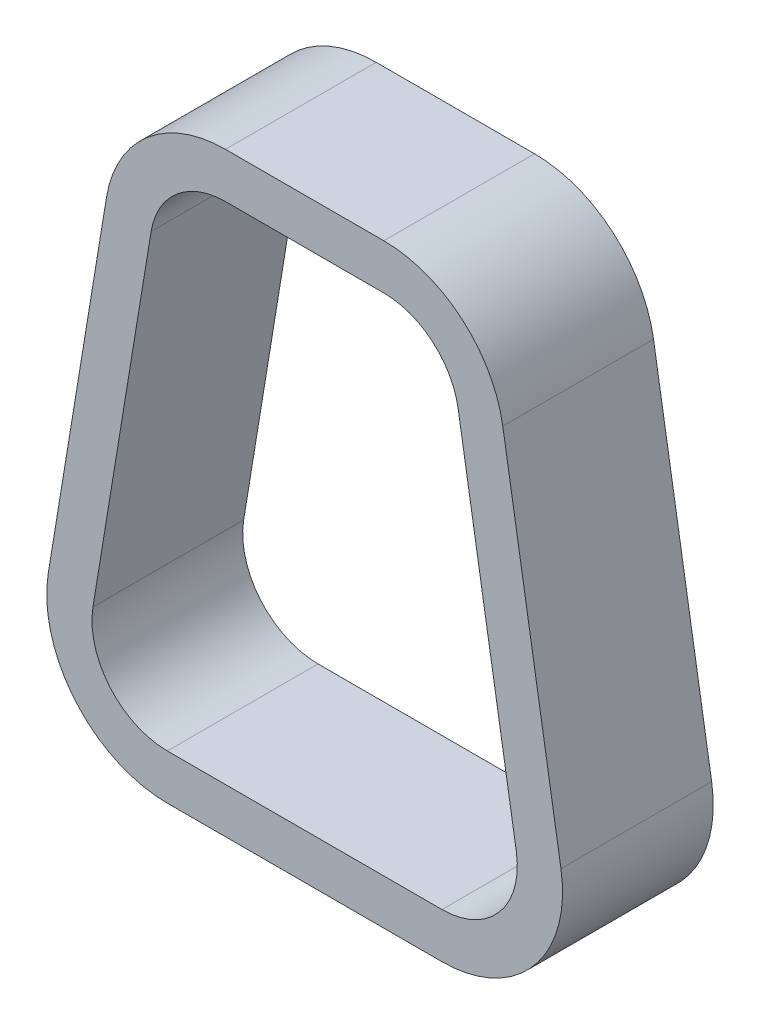
ISO-10303-21;
HEADER;
FILE_DESCRIPTION(('STEP AP214'),'2;1');
FILE_NAME('part.step','',(''),(''),'','','');
FILE_SCHEMA(('AUTOMOTIVE_DESIGN { 1 0 10303 214 1 1 1 1 }'));
ENDSEC;
DATA;
#1=APPLICATION_CONTEXT('core data for automotive mechanical design processes');
#2=APPLICATION_PROTOCOL_DEFINITION('international standard','automotive_design',2000,#1);
#3=PRODUCT_CONTEXT('',#1,'mechanical');
#4=PRODUCT('Part','Part','',(#3));
#5=PRODUCT_RELATED_PRODUCT_CATEGORY('part','',(#4));
#6=PRODUCT_DEFINITION_FORMATION('','',#4);
#7=PRODUCT_DEFINITION_CONTEXT('part definition',#1,'design');
#8=PRODUCT_DEFINITION('design','',#6,#7);
#9=PRODUCT_DEFINITION_SHAPE('','',#8);
#10=(LENGTH_UNIT() NAMED_UNIT(*) SI_UNIT(.MILLI.,.METRE.));
#11=(NAMED_UNIT(*) PLANE_ANGLE_UNIT() SI_UNIT($,.RADIAN.));
#12=(NAMED_UNIT(*) SI_UNIT($,.STERADIAN.) SOLID_ANGLE_UNIT());
#13=UNCERTAINTY_MEASURE_WITH_UNIT(LENGTH_MEASURE(1.E-05),#10,'distance_accuracy_value','');
#14=(GEOMETRIC_REPRESENTATION_CONTEXT(3) GLOBAL_UNCERTAINTY_ASSIGNED_CONTEXT((#13)) GLOBAL_UNIT_ASSIGNED_CONTEXT((#10,
#11,#12)) REPRESENTATION_CONTEXT('',''));
#15=CARTESIAN_POINT('',(0.,0.,0.));
#16=DIRECTION('',(0.,0.,1.));
#17=DIRECTION('',(1.,0.,0.));
#18=AXIS2_PLACEMENT_3D('',#15,#16,#17);
#19=CARTESIAN_POINT('',(0.,0.,0.));
#20=DIRECTION('',(0.,0.,1.));
#21=DIRECTION('',(1.,0.,0.));
#22=AXIS2_PLACEMENT_3D('',#19,#20,#21);
#23=PLANE('',#22);
#24=DIRECTION('',(1.,0.,0.));
#25=VECTOR('',#24,1.);
#26=CARTESIAN_POINT('',(-15.,-3.,0.));
#27=LINE('',#26,#25);
#28=CARTESIAN_POINT('',(-9.11216561290508,-3.,0.));
#29=VERTEX_POINT('',#28);
#30=CARTESIAN_POINT('',(9.11216561290509,-3.,0.));
#31=VERTEX_POINT('',#30);
#32=EDGE_CURVE('E232',#29,#31,#27,.T.);
#33=ORIENTED_EDGE('',*,*,#32,.F.);
#34=CARTESIAN_POINT('',(-9.11216561290509,5.,0.));
#35=DIRECTION('',(0.,0.,1.));
#36=DIRECTION('',(1.,0.,0.));
#37=AXIS2_PLACEMENT_3D('',#34,#35,#36);
#38=CIRCLE('',#37,8.);
#39=CARTESIAN_POINT('',(-17.0064783464996,6.29608119506774,0.));
#40=VERTEX_POINT('',#39);
#41=EDGE_CURVE('E226',#29,#40,#38,.F.);
#42=ORIENTED_EDGE('',*,*,#41,.T.);
#43=DIRECTION('',(-0.162010149383469,-0.986789091699309,0.));
#44=VECTOR('',#43,1.);
#45=CARTESIAN_POINT('',(-12.4603672750979,33.9860304481504,0.));
#46=LINE('',#45,#44);
#47=CARTESIAN_POINT('',(-13.1482693912757,29.7960811950678,0.));
#48=VERTEX_POINT('',#47);
#49=EDGE_CURVE('E253',#48,#40,#46,.T.);
#50=ORIENTED_EDGE('',*,*,#49,.F.);
#51=CARTESIAN_POINT('',(-5.25395665768121,28.5,0.));
#52=DIRECTION('',(0.,0.,1.));
#53=DIRECTION('',(1.,0.,0.));
#54=AXIS2_PLACEMENT_3D('',#51,#52,#53);
#55=CIRCLE('',#54,8.);
#56=CARTESIAN_POINT('',(-5.25395665768121,36.5,0.));
#57=VERTEX_POINT('',#56);
#58=EDGE_CURVE('E219',#48,#57,#55,.F.);
#59=ORIENTED_EDGE('',*,*,#58,.T.);
#60=DIRECTION('',(-1.,0.,0.));
#61=VECTOR('',#60,1.);
#62=CARTESIAN_POINT('',(-9.5,36.5,0.));
#63=LINE('',#62,#61);
#64=CARTESIAN_POINT('',(5.25395665768121,36.5,0.));
#65=VERTEX_POINT('',#64);
#66=EDGE_CURVE('E248',#65,#57,#63,.T.);
#67=ORIENTED_EDGE('',*,*,#66,.F.);
#68=CARTESIAN_POINT('',(5.25395665768121,28.5,0.));
#69=DIRECTION('',(0.,0.,1.));
#70=DIRECTION('',(1.,0.,0.));
#71=AXIS2_PLACEMENT_3D('',#68,#69,#70);
#72=CIRCLE('',#71,8.);
#73=CARTESIAN_POINT('',(13.1482693912757,29.7960811950677,0.));
#74=VERTEX_POINT('',#73);
#75=EDGE_CURVE('E41',#65,#74,#72,.F.);
#76=ORIENTED_EDGE('',*,*,#75,.T.);
#77=DIRECTION('',(-0.162010149383469,0.986789091699309,0.));
#78=VECTOR('',#77,1.);
#79=CARTESIAN_POINT('',(12.4603672750979,33.9860304481504,0.));
#80=LINE('',#79,#78);
#81=CARTESIAN_POINT('',(17.0064783464996,6.29608119506775,0.));
#82=VERTEX_POINT('',#81);
#83=EDGE_CURVE('E206',#82,#74,#80,.T.);
#84=ORIENTED_EDGE('',*,*,#83,.F.);
#85=CARTESIAN_POINT('',(9.11216561290509,5.,0.));
#86=DIRECTION('',(0.,0.,1.));
#87=DIRECTION('',(1.,0.,0.));
#88=AXIS2_PLACEMENT_3D('',#85,#86,#87);
#89=CIRCLE('',#88,8.);
#90=EDGE_CURVE('E249',#82,#31,#89,.F.);
#91=ORIENTED_EDGE('',*,*,#90,.T.);
#92=EDGE_LOOP('',(#33,#42,#50,#59,#67,#76,#84,#91));
#93=FACE_BOUND('',#92,.T.);
#94=CARTESIAN_POINT('',(-9.11216561290509,5.,0.));
#95=DIRECTION('',(0.,0.,1.));
#96=DIRECTION('',(1.,0.,0.));
#97=AXIS2_PLACEMENT_3D('',#94,#95,#96);
#98=CIRCLE('',#97,5.);
#99=CARTESIAN_POINT('',(-9.11216561290509,0.,0.));
#100=VERTEX_POINT('',#99);
#101=CARTESIAN_POINT('',(-14.0461110714016,5.81005074691734,0.));
#102=VERTEX_POINT('',#101);
#103=EDGE_CURVE('E159',#100,#102,#98,.F.);
#104=ORIENTED_EDGE('',*,*,#103,.F.);
#105=DIRECTION('',(1.,0.,0.));
#106=VECTOR('',#105,1.);
#107=CARTESIAN_POINT('',(-15.,0.,0.));
#108=LINE('',#107,#106);
#109=CARTESIAN_POINT('',(9.11216561290509,0.,0.));
#110=VERTEX_POINT('',#109);
#111=EDGE_CURVE('E171',#100,#110,#108,.T.);
#112=ORIENTED_EDGE('',*,*,#111,.T.);
#113=CARTESIAN_POINT('',(9.11216561290509,5.,0.));
#114=DIRECTION('',(0.,0.,1.));
#115=DIRECTION('',(1.,0.,0.));
#116=AXIS2_PLACEMENT_3D('',#113,#114,#115);
#117=CIRCLE('',#116,5.);
#118=CARTESIAN_POINT('',(14.0461110714016,5.81005074691734,0.));
#119=VERTEX_POINT('',#118);
#120=EDGE_CURVE('E182',#119,#110,#117,.F.);
#121=ORIENTED_EDGE('',*,*,#120,.F.);
#122=DIRECTION('',(-0.162010149383469,0.986789091699309,0.));
#123=VECTOR('',#122,1.);
#124=CARTESIAN_POINT('',(9.5,33.5,0.));
#125=LINE('',#124,#123);
#126=CARTESIAN_POINT('',(10.1879021161777,29.3100507469173,0.));
#127=VERTEX_POINT('',#126);
#128=EDGE_CURVE('E62',#119,#127,#125,.T.);
#129=ORIENTED_EDGE('',*,*,#128,.T.);
#130=CARTESIAN_POINT('',(5.25395665768121,28.5,0.));
#131=DIRECTION('',(0.,0.,1.));
#132=DIRECTION('',(1.,0.,0.));
#133=AXIS2_PLACEMENT_3D('',#130,#131,#132);
#134=CIRCLE('',#133,5.);
#135=CARTESIAN_POINT('',(5.25395665768121,33.5,0.));
#136=VERTEX_POINT('',#135);
#137=EDGE_CURVE('E186',#136,#127,#134,.F.);
#138=ORIENTED_EDGE('',*,*,#137,.F.);
#139=DIRECTION('',(-1.,0.,0.));
#140=VECTOR('',#139,1.);
#141=CARTESIAN_POINT('',(-9.5,33.5,0.));
#142=LINE('',#141,#140);
#143=CARTESIAN_POINT('',(-5.25395665768121,33.5,0.));
#144=VERTEX_POINT('',#143);
#145=EDGE_CURVE('E360',#136,#144,#142,.T.);
#146=ORIENTED_EDGE('',*,*,#145,.T.);
#147=CARTESIAN_POINT('',(-5.25395665768121,28.5,0.));
#148=DIRECTION('',(0.,0.,1.));
#149=DIRECTION('',(1.,0.,0.));
#150=AXIS2_PLACEMENT_3D('',#147,#148,#149);
#151=CIRCLE('',#150,5.);
#152=CARTESIAN_POINT('',(-10.1879021161777,29.3100507469173,0.));
#153=VERTEX_POINT('',#152);
#154=EDGE_CURVE('E166',#153,#144,#151,.F.);
#155=ORIENTED_EDGE('',*,*,#154,.F.);
#156=DIRECTION('',(-0.162010149383469,-0.986789091699309,0.));
#157=VECTOR('',#156,1.);
#158=CARTESIAN_POINT('',(-9.5,33.5,0.));
#159=LINE('',#158,#157);
#160=EDGE_CURVE('E176',#153,#102,#159,.T.);
#161=ORIENTED_EDGE('',*,*,#160,.T.);
#162=EDGE_LOOP('',(#104,#112,#121,#129,#138,#146,#155,#161));
#163=FACE_BOUND('',#162,.T.);
#164=ADVANCED_FACE('F37',(#93,#163),#23,.F.);
#165=CARTESIAN_POINT('',(12.4603672750979,33.9860304481504,10.));
#166=DIRECTION('',(-0.986789091699309,-0.162010149383469,0.));
#167=DIRECTION('',(0.162010149383469,-0.986789091699309,0.));
#168=AXIS2_PLACEMENT_3D('',#165,#166,#167);
#169=PLANE('',#168);
#170=DIRECTION('',(-0.162010149383469,0.986789091699309,0.));
#171=VECTOR('',#170,1.);
#172=CARTESIAN_POINT('',(12.4603672750979,33.9860304481504,10.));
#173=LINE('',#172,#171);
#174=CARTESIAN_POINT('',(17.0064783464996,6.29608119506774,10.));
#175=VERTEX_POINT('',#174);
#176=CARTESIAN_POINT('',(13.1482693912757,29.7960811950677,10.));
#177=VERTEX_POINT('',#176);
#178=EDGE_CURVE('E228',#175,#177,#173,.T.);
#179=ORIENTED_EDGE('',*,*,#178,.F.);
#180=DIRECTION('',(0.,0.,1.));
#181=VECTOR('',#180,1.);
#182=CARTESIAN_POINT('',(17.0064783464996,6.29608119506774,10.));
#183=LINE('',#182,#181);
#184=EDGE_CURVE('E207',#175,#82,#183,.F.);
#185=ORIENTED_EDGE('',*,*,#184,.T.);
#186=ORIENTED_EDGE('',*,*,#83,.T.);
#187=DIRECTION('',(0.,0.,1.));
#188=VECTOR('',#187,1.);
#189=CARTESIAN_POINT('',(13.1482693912757,29.7960811950677,10.));
#190=LINE('',#189,#188);
#191=EDGE_CURVE('E210',#74,#177,#190,.T.);
#192=ORIENTED_EDGE('',*,*,#191,.T.);
#193=EDGE_LOOP('',(#179,#185,#186,#192));
#194=FACE_BOUND('',#193,.T.);
#195=ADVANCED_FACE('F291',(#194),#169,.F.);
#196=CARTESIAN_POINT('',(-9.5,36.5,10.));
#197=DIRECTION('',(0.,-1.,0.));
#198=DIRECTION('',(0.,0.,-1.));
#199=AXIS2_PLACEMENT_3D('',#196,#197,#198);
#200=PLANE('',#199);
#201=DIRECTION('',(-1.,0.,0.));
#202=VECTOR('',#201,1.);
#203=CARTESIAN_POINT('',(-9.5,36.5,10.));
#204=LINE('',#203,#202);
#205=CARTESIAN_POINT('',(5.25395665768121,36.5,10.));
#206=VERTEX_POINT('',#205);
#207=CARTESIAN_POINT('',(-5.25395665768121,36.5,10.));
#208=VERTEX_POINT('',#207);
#209=EDGE_CURVE('E231',#206,#208,#204,.T.);
#210=ORIENTED_EDGE('',*,*,#209,.F.);
#211=DIRECTION('',(0.,0.,-1.));
#212=VECTOR('',#211,1.);
#213=CARTESIAN_POINT('',(5.25395665768121,36.5,10.));
#214=LINE('',#213,#212);
#215=EDGE_CURVE('E11',#206,#65,#214,.T.);
#216=ORIENTED_EDGE('',*,*,#215,.T.);
#217=ORIENTED_EDGE('',*,*,#66,.T.);
#218=DIRECTION('',(0.,0.,-1.));
#219=VECTOR('',#218,1.);
#220=CARTESIAN_POINT('',(-5.25395665768121,36.5,10.));
#221=LINE('',#220,#219);
#222=EDGE_CURVE('E46',#57,#208,#221,.F.);
#223=ORIENTED_EDGE('',*,*,#222,.T.);
#224=EDGE_LOOP('',(#210,#216,#217,#223));
#225=FACE_BOUND('',#224,.T.);
#226=ADVANCED_FACE('F262',(#225),#200,.F.);
#227=CARTESIAN_POINT('',(-12.4603672750979,33.9860304481504,10.));
#228=DIRECTION('',(0.986789091699309,-0.162010149383469,0.));
#229=DIRECTION('',(0.162010149383469,0.986789091699309,0.));
#230=AXIS2_PLACEMENT_3D('',#227,#228,#229);
#231=PLANE('',#230);
#232=ORIENTED_EDGE('',*,*,#49,.T.);
#233=DIRECTION('',(0.,0.,1.));
#234=VECTOR('',#233,1.);
#235=CARTESIAN_POINT('',(-17.0064783464996,6.29608119506774,10.));
#236=LINE('',#235,#234);
#237=CARTESIAN_POINT('',(-17.0064783464996,6.29608119506774,10.));
#238=VERTEX_POINT('',#237);
#239=EDGE_CURVE('E220',#40,#238,#236,.T.);
#240=ORIENTED_EDGE('',*,*,#239,.T.);
#241=DIRECTION('',(-0.162010149383469,-0.986789091699309,0.));
#242=VECTOR('',#241,1.);
#243=CARTESIAN_POINT('',(-12.4603672750979,33.9860304481504,10.));
#244=LINE('',#243,#242);
#245=CARTESIAN_POINT('',(-13.1482693912757,29.7960811950677,10.));
#246=VERTEX_POINT('',#245);
#247=EDGE_CURVE('E238',#246,#238,#244,.T.);
#248=ORIENTED_EDGE('',*,*,#247,.F.);
#249=DIRECTION('',(0.,0.,1.));
#250=VECTOR('',#249,1.);
#251=CARTESIAN_POINT('',(-13.1482693912757,29.7960811950677,10.));
#252=LINE('',#251,#250);
#253=EDGE_CURVE('E223',#246,#48,#252,.F.);
#254=ORIENTED_EDGE('',*,*,#253,.T.);
#255=EDGE_LOOP('',(#232,#240,#248,#254));
#256=FACE_BOUND('',#255,.T.);
#257=ADVANCED_FACE('F273',(#256),#231,.F.);
#258=CARTESIAN_POINT('',(-15.,-3.,10.));
#259=DIRECTION('',(0.,1.,0.));
#260=DIRECTION('',(0.,0.,1.));
#261=AXIS2_PLACEMENT_3D('',#258,#259,#260);
#262=PLANE('',#261);
#263=DIRECTION('',(1.,0.,0.));
#264=VECTOR('',#263,1.);
#265=CARTESIAN_POINT('',(-15.,-3.,10.));
#266=LINE('',#265,#264);
#267=CARTESIAN_POINT('',(-9.11216561290509,-3.,10.));
#268=VERTEX_POINT('',#267);
#269=CARTESIAN_POINT('',(9.11216561290509,-3.,10.));
#270=VERTEX_POINT('',#269);
#271=EDGE_CURVE('E216',#268,#270,#266,.T.);
#272=ORIENTED_EDGE('',*,*,#271,.F.);
#273=DIRECTION('',(0.,0.,1.));
#274=VECTOR('',#273,1.);
#275=CARTESIAN_POINT('',(-9.11216561290509,-3.,10.));
#276=LINE('',#275,#274);
#277=EDGE_CURVE('E215',#268,#29,#276,.F.);
#278=ORIENTED_EDGE('',*,*,#277,.T.);
#279=ORIENTED_EDGE('',*,*,#32,.T.);
#280=DIRECTION('',(0.,0.,1.));
#281=VECTOR('',#280,1.);
#282=CARTESIAN_POINT('',(9.11216561290509,-3.,10.));
#283=LINE('',#282,#281);
#284=EDGE_CURVE('E213',#31,#270,#283,.T.);
#285=ORIENTED_EDGE('',*,*,#284,.T.);
#286=EDGE_LOOP('',(#272,#278,#279,#285));
#287=FACE_BOUND('',#286,.T.);
#288=ADVANCED_FACE('F282',(#287),#262,.F.);
#289=CARTESIAN_POINT('',(0.,0.,10.));
#290=DIRECTION('',(0.,0.,1.));
#291=DIRECTION('',(1.,0.,0.));
#292=AXIS2_PLACEMENT_3D('',#289,#290,#291);
#293=PLANE('',#292);
#294=DIRECTION('',(-0.162010149383469,-0.986789091699309,0.));
#295=VECTOR('',#294,1.);
#296=CARTESIAN_POINT('',(-9.5,33.5,10.));
#297=LINE('',#296,#295);
#298=CARTESIAN_POINT('',(-10.1879021161777,29.3100507469173,10.));
#299=VERTEX_POINT('',#298);
#300=CARTESIAN_POINT('',(-14.0461110714016,5.81005074691734,10.));
#301=VERTEX_POINT('',#300);
#302=EDGE_CURVE('E352',#299,#301,#297,.T.);
#303=ORIENTED_EDGE('',*,*,#302,.F.);
#304=CARTESIAN_POINT('',(-5.25395665768121,28.5,10.));
#305=DIRECTION('',(0.,0.,1.));
#306=DIRECTION('',(1.,0.,0.));
#307=AXIS2_PLACEMENT_3D('',#304,#305,#306);
#308=CIRCLE('',#307,5.);
#309=CARTESIAN_POINT('',(-5.25395665768121,33.5,10.));
#310=VERTEX_POINT('',#309);
#311=EDGE_CURVE('E191',#310,#299,#308,.T.);
#312=ORIENTED_EDGE('',*,*,#311,.F.);
#313=DIRECTION('',(-1.,0.,0.));
#314=VECTOR('',#313,1.);
#315=CARTESIAN_POINT('',(-9.5,33.5,10.));
#316=LINE('',#315,#314);
#317=CARTESIAN_POINT('',(5.25395665768121,33.5,10.));
#318=VERTEX_POINT('',#317);
#319=EDGE_CURVE('E54',#318,#310,#316,.T.);
#320=ORIENTED_EDGE('',*,*,#319,.F.);
#321=CARTESIAN_POINT('',(5.25395665768121,28.5,10.));
#322=DIRECTION('',(0.,0.,1.));
#323=DIRECTION('',(1.,0.,0.));
#324=AXIS2_PLACEMENT_3D('',#321,#322,#323);
#325=CIRCLE('',#324,5.);
#326=CARTESIAN_POINT('',(10.1879021161777,29.3100507469173,10.));
#327=VERTEX_POINT('',#326);
#328=EDGE_CURVE('E193',#327,#318,#325,.T.);
#329=ORIENTED_EDGE('',*,*,#328,.F.);
#330=DIRECTION('',(-0.162010149383469,0.986789091699309,0.));
#331=VECTOR('',#330,1.);
#332=CARTESIAN_POINT('',(9.5,33.5,10.));
#333=LINE('',#332,#331);
#334=CARTESIAN_POINT('',(14.0461110714016,5.81005074691734,10.));
#335=VERTEX_POINT('',#334);
#336=EDGE_CURVE('E175',#335,#327,#333,.T.);
#337=ORIENTED_EDGE('',*,*,#336,.F.);
#338=CARTESIAN_POINT('',(9.11216561290509,5.,10.));
#339=DIRECTION('',(0.,0.,1.));
#340=DIRECTION('',(1.,0.,0.));
#341=AXIS2_PLACEMENT_3D('',#338,#339,#340);
#342=CIRCLE('',#341,5.);
#343=CARTESIAN_POINT('',(9.11216561290509,0.,10.));
#344=VERTEX_POINT('',#343);
#345=EDGE_CURVE('E195',#344,#335,#342,.T.);
#346=ORIENTED_EDGE('',*,*,#345,.F.);
#347=DIRECTION('',(1.,0.,0.));
#348=VECTOR('',#347,1.);
#349=CARTESIAN_POINT('',(-15.,0.,10.));
#350=LINE('',#349,#348);
#351=CARTESIAN_POINT('',(-9.11216561290509,0.,10.));
#352=VERTEX_POINT('',#351);
#353=EDGE_CURVE('E353',#352,#344,#350,.T.);
#354=ORIENTED_EDGE('',*,*,#353,.F.);
#355=CARTESIAN_POINT('',(-9.11216561290509,5.,10.));
#356=DIRECTION('',(0.,0.,1.));
#357=DIRECTION('',(1.,0.,0.));
#358=AXIS2_PLACEMENT_3D('',#355,#356,#357);
#359=CIRCLE('',#358,5.);
#360=EDGE_CURVE('E162',#301,#352,#359,.T.);
#361=ORIENTED_EDGE('',*,*,#360,.F.);
#362=EDGE_LOOP('',(#303,#312,#320,#329,#337,#346,#354,#361));
#363=FACE_BOUND('',#362,.T.);
#364=ORIENTED_EDGE('',*,*,#247,.T.);
#365=CARTESIAN_POINT('',(-9.11216561290509,5.,10.));
#366=DIRECTION('',(0.,0.,1.));
#367=DIRECTION('',(1.,0.,0.));
#368=AXIS2_PLACEMENT_3D('',#365,#366,#367);
#369=CIRCLE('',#368,8.);
#370=EDGE_CURVE('E212',#238,#268,#369,.T.);
#371=ORIENTED_EDGE('',*,*,#370,.T.);
#372=ORIENTED_EDGE('',*,*,#271,.T.);
#373=CARTESIAN_POINT('',(9.11216561290509,5.,10.));
#374=DIRECTION('',(0.,0.,1.));
#375=DIRECTION('',(1.,0.,0.));
#376=AXIS2_PLACEMENT_3D('',#373,#374,#375);
#377=CIRCLE('',#376,8.);
#378=EDGE_CURVE('E235',#270,#175,#377,.T.);
#379=ORIENTED_EDGE('',*,*,#378,.T.);
#380=ORIENTED_EDGE('',*,*,#178,.T.);
#381=CARTESIAN_POINT('',(5.25395665768121,28.5,10.));
#382=DIRECTION('',(0.,0.,1.));
#383=DIRECTION('',(1.,0.,0.));
#384=AXIS2_PLACEMENT_3D('',#381,#382,#383);
#385=CIRCLE('',#384,8.);
#386=EDGE_CURVE('E233',#177,#206,#385,.T.);
#387=ORIENTED_EDGE('',*,*,#386,.T.);
#388=ORIENTED_EDGE('',*,*,#209,.T.);
#389=CARTESIAN_POINT('',(-5.25395665768121,28.5,10.));
#390=DIRECTION('',(0.,0.,1.));
#391=DIRECTION('',(1.,0.,0.));
#392=AXIS2_PLACEMENT_3D('',#389,#390,#391);
#393=CIRCLE('',#392,8.);
#394=EDGE_CURVE('E222',#208,#246,#393,.T.);
#395=ORIENTED_EDGE('',*,*,#394,.T.);
#396=EDGE_LOOP('',(#364,#371,#372,#379,#380,#387,#388,#395));
#397=FACE_BOUND('',#396,.T.);
#398=ADVANCED_FACE('F270',(#363,#397),#293,.T.);
#399=CARTESIAN_POINT('',(-9.11216561290509,5.,10.));
#400=DIRECTION('',(0.,0.,-1.));
#401=DIRECTION('',(-1.,0.,0.));
#402=AXIS2_PLACEMENT_3D('',#399,#400,#401);
#403=CYLINDRICAL_SURFACE('',#402,8.);
#404=ORIENTED_EDGE('',*,*,#370,.F.);
#405=ORIENTED_EDGE('',*,*,#239,.F.);
#406=ORIENTED_EDGE('',*,*,#41,.F.);
#407=ORIENTED_EDGE('',*,*,#277,.F.);
#408=EDGE_LOOP('',(#404,#405,#406,#407));
#409=FACE_BOUND('',#408,.T.);
#410=ADVANCED_FACE('F277',(#409),#403,.T.);
#411=CARTESIAN_POINT('',(9.11216561290509,5.,10.));
#412=DIRECTION('',(0.,0.,-1.));
#413=DIRECTION('',(-1.,0.,0.));
#414=AXIS2_PLACEMENT_3D('',#411,#412,#413);
#415=CYLINDRICAL_SURFACE('',#414,8.);
#416=ORIENTED_EDGE('',*,*,#378,.F.);
#417=ORIENTED_EDGE('',*,*,#284,.F.);
#418=ORIENTED_EDGE('',*,*,#90,.F.);
#419=ORIENTED_EDGE('',*,*,#184,.F.);
#420=EDGE_LOOP('',(#416,#417,#418,#419));
#421=FACE_BOUND('',#420,.T.);
#422=ADVANCED_FACE('F286',(#421),#415,.T.);
#423=CARTESIAN_POINT('',(5.25395665768121,28.5,10.));
#424=DIRECTION('',(0.,0.,-1.));
#425=DIRECTION('',(-1.,0.,0.));
#426=AXIS2_PLACEMENT_3D('',#423,#424,#425);
#427=CYLINDRICAL_SURFACE('',#426,8.);
#428=ORIENTED_EDGE('',*,*,#386,.F.);
#429=ORIENTED_EDGE('',*,*,#191,.F.);
#430=ORIENTED_EDGE('',*,*,#75,.F.);
#431=ORIENTED_EDGE('',*,*,#215,.F.);
#432=EDGE_LOOP('',(#428,#429,#430,#431));
#433=FACE_BOUND('',#432,.T.);
#434=ADVANCED_FACE('F295',(#433),#427,.T.);
#435=CARTESIAN_POINT('',(-5.25395665768121,28.5,10.));
#436=DIRECTION('',(0.,0.,-1.));
#437=DIRECTION('',(-1.,0.,0.));
#438=AXIS2_PLACEMENT_3D('',#435,#436,#437);
#439=CYLINDRICAL_SURFACE('',#438,8.);
#440=ORIENTED_EDGE('',*,*,#394,.F.);
#441=ORIENTED_EDGE('',*,*,#222,.F.);
#442=ORIENTED_EDGE('',*,*,#58,.F.);
#443=ORIENTED_EDGE('',*,*,#253,.F.);
#444=EDGE_LOOP('',(#440,#441,#442,#443));
#445=FACE_BOUND('',#444,.T.);
#446=ADVANCED_FACE('F39',(#445),#439,.T.);
#447=CARTESIAN_POINT('',(9.5,33.5,10.));
#448=DIRECTION('',(-0.986789091699309,-0.162010149383469,0.));
#449=DIRECTION('',(0.162010149383469,-0.986789091699309,0.));
#450=AXIS2_PLACEMENT_3D('',#447,#448,#449);
#451=PLANE('',#450);
#452=ORIENTED_EDGE('',*,*,#336,.T.);
#453=DIRECTION('',(0.,0.,-1.));
#454=VECTOR('',#453,1.);
#455=CARTESIAN_POINT('',(10.1879021161777,29.3100507469173,10.));
#456=LINE('',#455,#454);
#457=EDGE_CURVE('E198',#127,#327,#456,.F.);
#458=ORIENTED_EDGE('',*,*,#457,.F.);
#459=ORIENTED_EDGE('',*,*,#128,.F.);
#460=DIRECTION('',(0.,0.,-1.));
#461=VECTOR('',#460,1.);
#462=CARTESIAN_POINT('',(14.0461110714016,5.81005074691734,10.));
#463=LINE('',#462,#461);
#464=EDGE_CURVE('E200',#335,#119,#463,.T.);
#465=ORIENTED_EDGE('',*,*,#464,.F.);
#466=EDGE_LOOP('',(#452,#458,#459,#465));
#467=FACE_BOUND('',#466,.T.);
#468=ADVANCED_FACE('F318',(#467),#451,.T.);
#469=CARTESIAN_POINT('',(-9.5,33.5,10.));
#470=DIRECTION('',(0.,-1.,0.));
#471=DIRECTION('',(0.,0.,-1.));
#472=AXIS2_PLACEMENT_3D('',#469,#470,#471);
#473=PLANE('',#472);
#474=ORIENTED_EDGE('',*,*,#319,.T.);
#475=DIRECTION('',(0.,0.,-1.));
#476=VECTOR('',#475,1.);
#477=CARTESIAN_POINT('',(-5.25395665768121,33.5,10.));
#478=LINE('',#477,#476);
#479=EDGE_CURVE('E202',#144,#310,#478,.F.);
#480=ORIENTED_EDGE('',*,*,#479,.F.);
#481=ORIENTED_EDGE('',*,*,#145,.F.);
#482=DIRECTION('',(0.,0.,-1.));
#483=VECTOR('',#482,1.);
#484=CARTESIAN_POINT('',(5.25395665768121,33.5,10.));
#485=LINE('',#484,#483);
#486=EDGE_CURVE('E204',#318,#136,#485,.T.);
#487=ORIENTED_EDGE('',*,*,#486,.F.);
#488=EDGE_LOOP('',(#474,#480,#481,#487));
#489=FACE_BOUND('',#488,.T.);
#490=ADVANCED_FACE('F322',(#489),#473,.T.);
#491=CARTESIAN_POINT('',(-9.5,33.5,10.));
#492=DIRECTION('',(0.986789091699309,-0.162010149383469,0.));
#493=DIRECTION('',(0.162010149383469,0.986789091699309,0.));
#494=AXIS2_PLACEMENT_3D('',#491,#492,#493);
#495=PLANE('',#494);
#496=ORIENTED_EDGE('',*,*,#160,.F.);
#497=DIRECTION('',(0.,0.,-1.));
#498=VECTOR('',#497,1.);
#499=CARTESIAN_POINT('',(-10.1879021161777,29.3100507469173,10.));
#500=LINE('',#499,#498);
#501=EDGE_CURVE('E181',#299,#153,#500,.T.);
#502=ORIENTED_EDGE('',*,*,#501,.F.);
#503=ORIENTED_EDGE('',*,*,#302,.T.);
#504=DIRECTION('',(0.,0.,-1.));
#505=VECTOR('',#504,1.);
#506=CARTESIAN_POINT('',(-14.0461110714016,5.81005074691734,10.));
#507=LINE('',#506,#505);
#508=EDGE_CURVE('E184',#102,#301,#507,.F.);
#509=ORIENTED_EDGE('',*,*,#508,.F.);
#510=EDGE_LOOP('',(#496,#502,#503,#509));
#511=FACE_BOUND('',#510,.T.);
#512=ADVANCED_FACE('F327',(#511),#495,.T.);
#513=CARTESIAN_POINT('',(-15.,0.,10.));
#514=DIRECTION('',(0.,1.,0.));
#515=DIRECTION('',(0.,0.,1.));
#516=AXIS2_PLACEMENT_3D('',#513,#514,#515);
#517=PLANE('',#516);
#518=ORIENTED_EDGE('',*,*,#353,.T.);
#519=DIRECTION('',(0.,0.,-1.));
#520=VECTOR('',#519,1.);
#521=CARTESIAN_POINT('',(9.11216561290509,0.,10.));
#522=LINE('',#521,#520);
#523=EDGE_CURVE('E167',#110,#344,#522,.F.);
#524=ORIENTED_EDGE('',*,*,#523,.F.);
#525=ORIENTED_EDGE('',*,*,#111,.F.);
#526=DIRECTION('',(0.,0.,-1.));
#527=VECTOR('',#526,1.);
#528=CARTESIAN_POINT('',(-9.11216561290509,0.,10.));
#529=LINE('',#528,#527);
#530=EDGE_CURVE('E155',#352,#100,#529,.T.);
#531=ORIENTED_EDGE('',*,*,#530,.F.);
#532=EDGE_LOOP('',(#518,#524,#525,#531));
#533=FACE_BOUND('',#532,.T.);
#534=ADVANCED_FACE('F172',(#533),#517,.T.);
#535=CARTESIAN_POINT('',(-9.11216561290509,5.,10.));
#536=DIRECTION('',(0.,0.,-1.));
#537=DIRECTION('',(-1.,0.,0.));
#538=AXIS2_PLACEMENT_3D('',#535,#536,#537);
#539=CYLINDRICAL_SURFACE('',#538,5.);
#540=ORIENTED_EDGE('',*,*,#360,.T.);
#541=ORIENTED_EDGE('',*,*,#530,.T.);
#542=ORIENTED_EDGE('',*,*,#103,.T.);
#543=ORIENTED_EDGE('',*,*,#508,.T.);
#544=EDGE_LOOP('',(#540,#541,#542,#543));
#545=FACE_BOUND('',#544,.T.);
#546=ADVANCED_FACE('F157',(#545),#539,.F.);
#547=CARTESIAN_POINT('',(9.11216561290509,5.,10.));
#548=DIRECTION('',(0.,0.,-1.));
#549=DIRECTION('',(-1.,0.,0.));
#550=AXIS2_PLACEMENT_3D('',#547,#548,#549);
#551=CYLINDRICAL_SURFACE('',#550,5.);
#552=ORIENTED_EDGE('',*,*,#345,.T.);
#553=ORIENTED_EDGE('',*,*,#464,.T.);
#554=ORIENTED_EDGE('',*,*,#120,.T.);
#555=ORIENTED_EDGE('',*,*,#523,.T.);
#556=EDGE_LOOP('',(#552,#553,#554,#555));
#557=FACE_BOUND('',#556,.T.);
#558=ADVANCED_FACE('F334',(#557),#551,.F.);
#559=CARTESIAN_POINT('',(5.25395665768121,28.5,10.));
#560=DIRECTION('',(0.,0.,-1.));
#561=DIRECTION('',(-1.,0.,0.));
#562=AXIS2_PLACEMENT_3D('',#559,#560,#561);
#563=CYLINDRICAL_SURFACE('',#562,5.);
#564=ORIENTED_EDGE('',*,*,#328,.T.);
#565=ORIENTED_EDGE('',*,*,#486,.T.);
#566=ORIENTED_EDGE('',*,*,#137,.T.);
#567=ORIENTED_EDGE('',*,*,#457,.T.);
#568=EDGE_LOOP('',(#564,#565,#566,#567));
#569=FACE_BOUND('',#568,.T.);
#570=ADVANCED_FACE('F337',(#569),#563,.F.);
#571=CARTESIAN_POINT('',(-5.25395665768121,28.5,10.));
#572=DIRECTION('',(0.,0.,-1.));
#573=DIRECTION('',(-1.,0.,0.));
#574=AXIS2_PLACEMENT_3D('',#571,#572,#573);
#575=CYLINDRICAL_SURFACE('',#574,5.);
#576=ORIENTED_EDGE('',*,*,#311,.T.);
#577=ORIENTED_EDGE('',*,*,#501,.T.);
#578=ORIENTED_EDGE('',*,*,#154,.T.);
#579=ORIENTED_EDGE('',*,*,#479,.T.);
#580=EDGE_LOOP('',(#576,#577,#578,#579));
#581=FACE_BOUND('',#580,.T.);
#582=ADVANCED_FACE('F340',(#581),#575,.F.);
#583=CLOSED_SHELL('',(#164,#195,#226,#257,#288,#398,#410,#422,#434,#446,#468,#490,#512,#534,
#546,#558,#570,#582));
#584=MANIFOLD_SOLID_BREP('B2',#583);
#585=ADVANCED_BREP_SHAPE_REPRESENTATION('',(#18,#584),#14);
#586=SHAPE_DEFINITION_REPRESENTATION(#9,#585);
ENDSEC;
END-ISO-10303-21;
